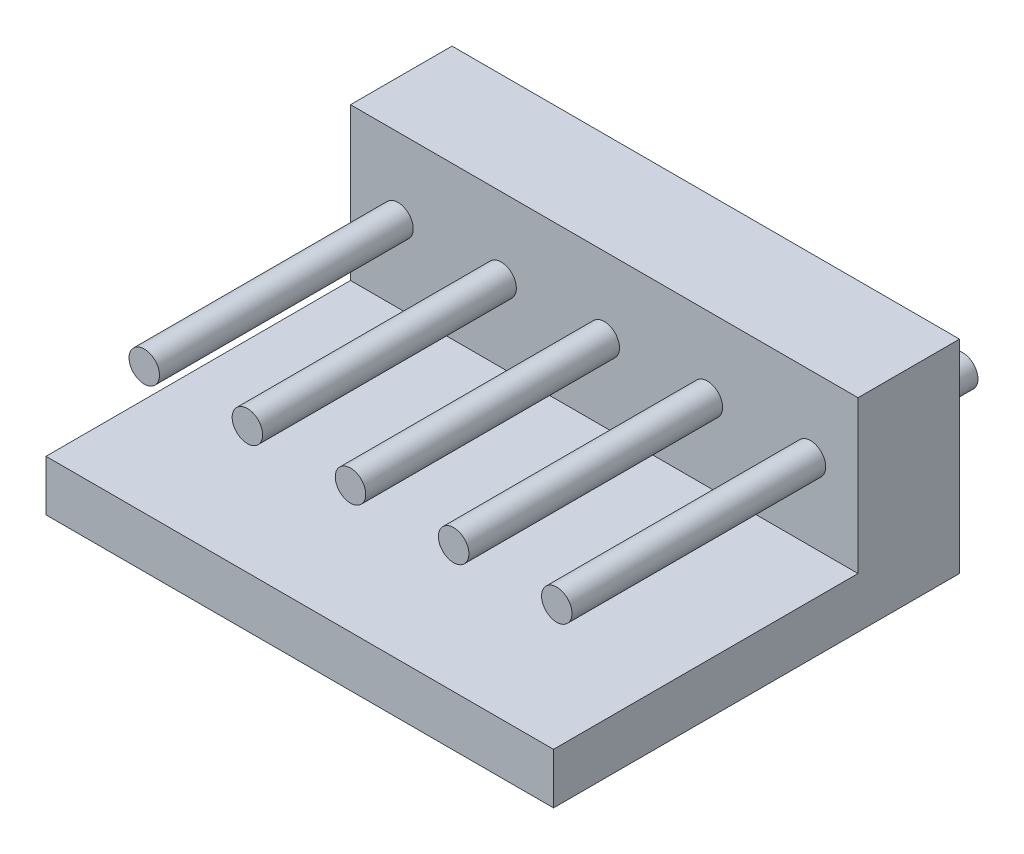
ISO-10303-21;
HEADER;
FILE_DESCRIPTION(('STEP AP214'),'2;1');
FILE_NAME('part.step','',(''),(''),'','','');
FILE_SCHEMA(('AUTOMOTIVE_DESIGN { 1 0 10303 214 1 1 1 1 }'));
ENDSEC;
DATA;
#1=APPLICATION_CONTEXT('core data for automotive mechanical design processes');
#2=APPLICATION_PROTOCOL_DEFINITION('international standard','automotive_design',2000,#1);
#3=PRODUCT_CONTEXT('',#1,'mechanical');
#4=PRODUCT('Part','Part','',(#3));
#5=PRODUCT_RELATED_PRODUCT_CATEGORY('part','',(#4));
#6=PRODUCT_DEFINITION_FORMATION('','',#4);
#7=PRODUCT_DEFINITION_CONTEXT('part definition',#1,'design');
#8=PRODUCT_DEFINITION('design','',#6,#7);
#9=PRODUCT_DEFINITION_SHAPE('','',#8);
#10=(LENGTH_UNIT() NAMED_UNIT(*) SI_UNIT(.MILLI.,.METRE.));
#11=(NAMED_UNIT(*) PLANE_ANGLE_UNIT() SI_UNIT($,.RADIAN.));
#12=(NAMED_UNIT(*) SI_UNIT($,.STERADIAN.) SOLID_ANGLE_UNIT());
#13=UNCERTAINTY_MEASURE_WITH_UNIT(LENGTH_MEASURE(1.E-05),#10,'distance_accuracy_value','');
#14=(GEOMETRIC_REPRESENTATION_CONTEXT(3) GLOBAL_UNCERTAINTY_ASSIGNED_CONTEXT((#13)) GLOBAL_UNIT_ASSIGNED_CONTEXT((#10,
#11,#12)) REPRESENTATION_CONTEXT('',''));
#15=CARTESIAN_POINT('',(0.,0.,0.));
#16=DIRECTION('',(0.,0.,1.));
#17=DIRECTION('',(1.,0.,0.));
#18=AXIS2_PLACEMENT_3D('',#15,#16,#17);
#19=CARTESIAN_POINT('',(0.,10.,5.));
#20=DIRECTION('',(0.,0.,-1.));
#21=DIRECTION('',(-1.,0.,0.));
#22=AXIS2_PLACEMENT_3D('',#19,#20,#21);
#23=PLANE('',#22);
#24=CARTESIAN_POINT('',(2.34,6.25,5.));
#25=DIRECTION('',(0.,0.,-1.));
#26=DIRECTION('',(-1.,0.,0.));
#27=AXIS2_PLACEMENT_3D('',#24,#25,#26);
#28=CIRCLE('',#27,0.750000000000001);
#29=CARTESIAN_POINT('',(1.59,6.25,5.));
#30=VERTEX_POINT('',#29);
#31=EDGE_CURVE('E38',#30,#30,#28,.F.);
#32=ORIENTED_EDGE('',*,*,#31,.F.);
#33=EDGE_LOOP('',(#32));
#34=FACE_BOUND('',#33,.T.);
#35=CARTESIAN_POINT('',(7.42,6.25,5.));
#36=DIRECTION('',(0.,0.,-1.));
#37=DIRECTION('',(-1.,0.,0.));
#38=AXIS2_PLACEMENT_3D('',#35,#36,#37);
#39=CIRCLE('',#38,0.75);
#40=CARTESIAN_POINT('',(6.67,6.25,5.));
#41=VERTEX_POINT('',#40);
#42=EDGE_CURVE('E151',#41,#41,#39,.F.);
#43=ORIENTED_EDGE('',*,*,#42,.F.);
#44=EDGE_LOOP('',(#43));
#45=FACE_BOUND('',#44,.T.);
#46=DIRECTION('',(-1.,0.,0.));
#47=VECTOR('',#46,1.);
#48=CARTESIAN_POINT('',(0.,2.5,5.));
#49=LINE('',#48,#47);
#50=CARTESIAN_POINT('',(25.,2.5,5.));
#51=VERTEX_POINT('',#50);
#52=CARTESIAN_POINT('',(0.,2.5,5.));
#53=VERTEX_POINT('',#52);
#54=EDGE_CURVE('E46',#51,#53,#49,.T.);
#55=ORIENTED_EDGE('',*,*,#54,.F.);
#56=DIRECTION('',(0.,1.,0.));
#57=VECTOR('',#56,1.);
#58=CARTESIAN_POINT('',(25.,0.,5.));
#59=LINE('',#58,#57);
#60=CARTESIAN_POINT('',(25.,10.,5.));
#61=VERTEX_POINT('',#60);
#62=EDGE_CURVE('E86',#51,#61,#59,.T.);
#63=ORIENTED_EDGE('',*,*,#62,.T.);
#64=DIRECTION('',(-1.,0.,0.));
#65=VECTOR('',#64,1.);
#66=CARTESIAN_POINT('',(0.,10.,5.));
#67=LINE('',#66,#65);
#68=CARTESIAN_POINT('',(0.,10.,5.));
#69=VERTEX_POINT('',#68);
#70=EDGE_CURVE('E51',#61,#69,#67,.T.);
#71=ORIENTED_EDGE('',*,*,#70,.T.);
#72=DIRECTION('',(0.,-1.,0.));
#73=VECTOR('',#72,1.);
#74=CARTESIAN_POINT('',(0.,0.,5.));
#75=LINE('',#74,#73);
#76=EDGE_CURVE('E81',#69,#53,#75,.T.);
#77=ORIENTED_EDGE('',*,*,#76,.T.);
#78=EDGE_LOOP('',(#55,#63,#71,#77));
#79=FACE_BOUND('',#78,.T.);
#80=CARTESIAN_POINT('',(17.58,6.25,5.));
#81=DIRECTION('',(0.,0.,-1.));
#82=DIRECTION('',(-1.,0.,0.));
#83=AXIS2_PLACEMENT_3D('',#80,#81,#82);
#84=CIRCLE('',#83,0.750000000000002);
#85=CARTESIAN_POINT('',(16.83,6.25,5.));
#86=VERTEX_POINT('',#85);
#87=EDGE_CURVE('E158',#86,#86,#84,.F.);
#88=ORIENTED_EDGE('',*,*,#87,.F.);
#89=EDGE_LOOP('',(#88));
#90=FACE_BOUND('',#89,.T.);
#91=CARTESIAN_POINT('',(22.66,6.25,5.));
#92=DIRECTION('',(0.,0.,-1.));
#93=DIRECTION('',(-1.,0.,0.));
#94=AXIS2_PLACEMENT_3D('',#91,#92,#93);
#95=CIRCLE('',#94,0.750000000000002);
#96=CARTESIAN_POINT('',(21.91,6.25,5.));
#97=VERTEX_POINT('',#96);
#98=EDGE_CURVE('E145',#97,#97,#95,.F.);
#99=ORIENTED_EDGE('',*,*,#98,.F.);
#100=EDGE_LOOP('',(#99));
#101=FACE_BOUND('',#100,.T.);
#102=CARTESIAN_POINT('',(12.5,6.25,5.));
#103=DIRECTION('',(0.,0.,-1.));
#104=DIRECTION('',(-1.,0.,0.));
#105=AXIS2_PLACEMENT_3D('',#102,#103,#104);
#106=CIRCLE('',#105,0.75);
#107=CARTESIAN_POINT('',(11.75,6.25,5.));
#108=VERTEX_POINT('',#107);
#109=EDGE_CURVE('E11',#108,#108,#106,.F.);
#110=ORIENTED_EDGE('',*,*,#109,.F.);
#111=EDGE_LOOP('',(#110));
#112=FACE_BOUND('',#111,.T.);
#113=ADVANCED_FACE('F29',(#34,#45,#79,#90,#101,#112),#23,.F.);
#114=CARTESIAN_POINT('',(0.,10.,0.));
#115=DIRECTION('',(0.,0.,-1.));
#116=DIRECTION('',(-1.,0.,0.));
#117=AXIS2_PLACEMENT_3D('',#114,#115,#116);
#118=PLANE('',#117);
#119=CARTESIAN_POINT('',(2.34,6.25,0.));
#120=DIRECTION('',(0.,0.,-1.));
#121=DIRECTION('',(-1.,0.,0.));
#122=AXIS2_PLACEMENT_3D('',#119,#120,#121);
#123=CIRCLE('',#122,0.750000000000001);
#124=CARTESIAN_POINT('',(1.59,6.25,0.));
#125=VERTEX_POINT('',#124);
#126=EDGE_CURVE('E128',#125,#125,#123,.F.);
#127=ORIENTED_EDGE('',*,*,#126,.T.);
#128=EDGE_LOOP('',(#127));
#129=FACE_BOUND('',#128,.T.);
#130=CARTESIAN_POINT('',(7.42,6.25,0.));
#131=DIRECTION('',(0.,0.,-1.));
#132=DIRECTION('',(-1.,0.,0.));
#133=AXIS2_PLACEMENT_3D('',#130,#131,#132);
#134=CIRCLE('',#133,0.75);
#135=CARTESIAN_POINT('',(6.67,6.25,0.));
#136=VERTEX_POINT('',#135);
#137=EDGE_CURVE('E119',#136,#136,#134,.F.);
#138=ORIENTED_EDGE('',*,*,#137,.T.);
#139=EDGE_LOOP('',(#138));
#140=FACE_BOUND('',#139,.T.);
#141=DIRECTION('',(0.,-1.,0.));
#142=VECTOR('',#141,1.);
#143=CARTESIAN_POINT('',(0.,0.,0.));
#144=LINE('',#143,#142);
#145=CARTESIAN_POINT('',(0.,10.,0.));
#146=VERTEX_POINT('',#145);
#147=CARTESIAN_POINT('',(0.,0.,0.));
#148=VERTEX_POINT('',#147);
#149=EDGE_CURVE('E105',#146,#148,#144,.T.);
#150=ORIENTED_EDGE('',*,*,#149,.F.);
#151=DIRECTION('',(-1.,0.,0.));
#152=VECTOR('',#151,1.);
#153=CARTESIAN_POINT('',(0.,10.,0.));
#154=LINE('',#153,#152);
#155=CARTESIAN_POINT('',(25.,10.,0.));
#156=VERTEX_POINT('',#155);
#157=EDGE_CURVE('E87',#156,#146,#154,.T.);
#158=ORIENTED_EDGE('',*,*,#157,.F.);
#159=DIRECTION('',(0.,1.,0.));
#160=VECTOR('',#159,1.);
#161=CARTESIAN_POINT('',(25.,0.,0.));
#162=LINE('',#161,#160);
#163=CARTESIAN_POINT('',(25.,0.,0.));
#164=VERTEX_POINT('',#163);
#165=EDGE_CURVE('E175',#164,#156,#162,.T.);
#166=ORIENTED_EDGE('',*,*,#165,.F.);
#167=DIRECTION('',(1.,0.,0.));
#168=VECTOR('',#167,1.);
#169=CARTESIAN_POINT('',(0.,0.,0.));
#170=LINE('',#169,#168);
#171=EDGE_CURVE('E173',#148,#164,#170,.T.);
#172=ORIENTED_EDGE('',*,*,#171,.F.);
#173=EDGE_LOOP('',(#150,#158,#166,#172));
#174=FACE_BOUND('',#173,.T.);
#175=CARTESIAN_POINT('',(17.58,6.25,0.));
#176=DIRECTION('',(0.,0.,-1.));
#177=DIRECTION('',(-1.,0.,0.));
#178=AXIS2_PLACEMENT_3D('',#175,#176,#177);
#179=CIRCLE('',#178,0.750000000000002);
#180=CARTESIAN_POINT('',(16.83,6.25,0.));
#181=VERTEX_POINT('',#180);
#182=EDGE_CURVE('E99',#181,#181,#179,.F.);
#183=ORIENTED_EDGE('',*,*,#182,.T.);
#184=EDGE_LOOP('',(#183));
#185=FACE_BOUND('',#184,.T.);
#186=CARTESIAN_POINT('',(22.66,6.25,0.));
#187=DIRECTION('',(0.,0.,-1.));
#188=DIRECTION('',(-1.,0.,0.));
#189=AXIS2_PLACEMENT_3D('',#186,#187,#188);
#190=CIRCLE('',#189,0.750000000000002);
#191=CARTESIAN_POINT('',(21.91,6.25,0.));
#192=VERTEX_POINT('',#191);
#193=EDGE_CURVE('E124',#192,#192,#190,.F.);
#194=ORIENTED_EDGE('',*,*,#193,.T.);
#195=EDGE_LOOP('',(#194));
#196=FACE_BOUND('',#195,.T.);
#197=CARTESIAN_POINT('',(12.5,6.25,0.));
#198=DIRECTION('',(0.,0.,-1.));
#199=DIRECTION('',(-1.,0.,0.));
#200=AXIS2_PLACEMENT_3D('',#197,#198,#199);
#201=CIRCLE('',#200,0.75);
#202=CARTESIAN_POINT('',(11.75,6.25,0.));
#203=VERTEX_POINT('',#202);
#204=EDGE_CURVE('E33',#203,#203,#201,.F.);
#205=ORIENTED_EDGE('',*,*,#204,.T.);
#206=EDGE_LOOP('',(#205));
#207=FACE_BOUND('',#206,.T.);
#208=ADVANCED_FACE('F202',(#129,#140,#174,#185,#196,#207),#118,.T.);
#209=CARTESIAN_POINT('',(0.,0.,5.));
#210=DIRECTION('',(1.,0.,0.));
#211=DIRECTION('',(0.,0.,-1.));
#212=AXIS2_PLACEMENT_3D('',#209,#210,#211);
#213=PLANE('',#212);
#214=ORIENTED_EDGE('',*,*,#149,.T.);
#215=DIRECTION('',(0.,0.,-1.));
#216=VECTOR('',#215,1.);
#217=CARTESIAN_POINT('',(0.,0.,5.));
#218=LINE('',#217,#216);
#219=CARTESIAN_POINT('',(0.,0.,20.));
#220=VERTEX_POINT('',#219);
#221=EDGE_CURVE('E164',#220,#148,#218,.T.);
#222=ORIENTED_EDGE('',*,*,#221,.F.);
#223=DIRECTION('',(0.,-1.,0.));
#224=VECTOR('',#223,1.);
#225=CARTESIAN_POINT('',(0.,0.,20.));
#226=LINE('',#225,#224);
#227=CARTESIAN_POINT('',(0.,2.5,20.));
#228=VERTEX_POINT('',#227);
#229=EDGE_CURVE('E98',#228,#220,#226,.T.);
#230=ORIENTED_EDGE('',*,*,#229,.F.);
#231=DIRECTION('',(0.,0.,-1.));
#232=VECTOR('',#231,1.);
#233=CARTESIAN_POINT('',(0.,2.5,20.));
#234=LINE('',#233,#232);
#235=EDGE_CURVE('E94',#228,#53,#234,.T.);
#236=ORIENTED_EDGE('',*,*,#235,.T.);
#237=ORIENTED_EDGE('',*,*,#76,.F.);
#238=DIRECTION('',(0.,0.,-1.));
#239=VECTOR('',#238,1.);
#240=CARTESIAN_POINT('',(0.,10.,5.));
#241=LINE('',#240,#239);
#242=EDGE_CURVE('E185',#69,#146,#241,.T.);
#243=ORIENTED_EDGE('',*,*,#242,.T.);
#244=EDGE_LOOP('',(#214,#222,#230,#236,#237,#243));
#245=FACE_BOUND('',#244,.T.);
#246=ADVANCED_FACE('F31',(#245),#213,.F.);
#247=CARTESIAN_POINT('',(0.,0.,5.));
#248=DIRECTION('',(0.,1.,0.));
#249=DIRECTION('',(0.,0.,1.));
#250=AXIS2_PLACEMENT_3D('',#247,#248,#249);
#251=PLANE('',#250);
#252=ORIENTED_EDGE('',*,*,#171,.T.);
#253=DIRECTION('',(0.,0.,-1.));
#254=VECTOR('',#253,1.);
#255=CARTESIAN_POINT('',(25.,0.,5.));
#256=LINE('',#255,#254);
#257=CARTESIAN_POINT('',(25.,0.,20.));
#258=VERTEX_POINT('',#257);
#259=EDGE_CURVE('E190',#258,#164,#256,.T.);
#260=ORIENTED_EDGE('',*,*,#259,.F.);
#261=DIRECTION('',(1.,0.,0.));
#262=VECTOR('',#261,1.);
#263=CARTESIAN_POINT('',(0.,0.,20.));
#264=LINE('',#263,#262);
#265=EDGE_CURVE('E168',#220,#258,#264,.T.);
#266=ORIENTED_EDGE('',*,*,#265,.F.);
#267=ORIENTED_EDGE('',*,*,#221,.T.);
#268=EDGE_LOOP('',(#252,#260,#266,#267));
#269=FACE_BOUND('',#268,.T.);
#270=ADVANCED_FACE('F198',(#269),#251,.F.);
#271=CARTESIAN_POINT('',(25.,0.,5.));
#272=DIRECTION('',(-1.,0.,0.));
#273=DIRECTION('',(0.,0.,1.));
#274=AXIS2_PLACEMENT_3D('',#271,#272,#273);
#275=PLANE('',#274);
#276=ORIENTED_EDGE('',*,*,#165,.T.);
#277=DIRECTION('',(0.,0.,-1.));
#278=VECTOR('',#277,1.);
#279=CARTESIAN_POINT('',(25.,10.,5.));
#280=LINE('',#279,#278);
#281=EDGE_CURVE('E186',#61,#156,#280,.T.);
#282=ORIENTED_EDGE('',*,*,#281,.F.);
#283=ORIENTED_EDGE('',*,*,#62,.F.);
#284=DIRECTION('',(0.,0.,-1.));
#285=VECTOR('',#284,1.);
#286=CARTESIAN_POINT('',(25.,2.5,20.));
#287=LINE('',#286,#285);
#288=CARTESIAN_POINT('',(25.,2.5,20.));
#289=VERTEX_POINT('',#288);
#290=EDGE_CURVE('E97',#289,#51,#287,.T.);
#291=ORIENTED_EDGE('',*,*,#290,.F.);
#292=DIRECTION('',(0.,1.,0.));
#293=VECTOR('',#292,1.);
#294=CARTESIAN_POINT('',(25.,0.,20.));
#295=LINE('',#294,#293);
#296=EDGE_CURVE('E107',#258,#289,#295,.T.);
#297=ORIENTED_EDGE('',*,*,#296,.F.);
#298=ORIENTED_EDGE('',*,*,#259,.T.);
#299=EDGE_LOOP('',(#276,#282,#283,#291,#297,#298));
#300=FACE_BOUND('',#299,.T.);
#301=ADVANCED_FACE('F204',(#300),#275,.F.);
#302=CARTESIAN_POINT('',(0.,10.,5.));
#303=DIRECTION('',(0.,-1.,0.));
#304=DIRECTION('',(0.,0.,-1.));
#305=AXIS2_PLACEMENT_3D('',#302,#303,#304);
#306=PLANE('',#305);
#307=ORIENTED_EDGE('',*,*,#157,.T.);
#308=ORIENTED_EDGE('',*,*,#242,.F.);
#309=ORIENTED_EDGE('',*,*,#70,.F.);
#310=ORIENTED_EDGE('',*,*,#281,.T.);
#311=EDGE_LOOP('',(#307,#308,#309,#310));
#312=FACE_BOUND('',#311,.T.);
#313=ADVANCED_FACE('F206',(#312),#306,.F.);
#314=CARTESIAN_POINT('',(0.,2.5,20.));
#315=DIRECTION('',(0.,-1.,0.));
#316=DIRECTION('',(0.,0.,-1.));
#317=AXIS2_PLACEMENT_3D('',#314,#315,#316);
#318=PLANE('',#317);
#319=ORIENTED_EDGE('',*,*,#54,.T.);
#320=ORIENTED_EDGE('',*,*,#235,.F.);
#321=DIRECTION('',(-1.,0.,0.));
#322=VECTOR('',#321,1.);
#323=CARTESIAN_POINT('',(0.,2.5,20.));
#324=LINE('',#323,#322);
#325=EDGE_CURVE('E103',#289,#228,#324,.T.);
#326=ORIENTED_EDGE('',*,*,#325,.F.);
#327=ORIENTED_EDGE('',*,*,#290,.T.);
#328=EDGE_LOOP('',(#319,#320,#326,#327));
#329=FACE_BOUND('',#328,.T.);
#330=ADVANCED_FACE('F92',(#329),#318,.F.);
#331=CARTESIAN_POINT('',(0.,2.5,20.));
#332=DIRECTION('',(0.,0.,-1.));
#333=DIRECTION('',(-1.,0.,0.));
#334=AXIS2_PLACEMENT_3D('',#331,#332,#333);
#335=PLANE('',#334);
#336=ORIENTED_EDGE('',*,*,#229,.T.);
#337=ORIENTED_EDGE('',*,*,#265,.T.);
#338=ORIENTED_EDGE('',*,*,#296,.T.);
#339=ORIENTED_EDGE('',*,*,#325,.T.);
#340=EDGE_LOOP('',(#336,#337,#338,#339));
#341=FACE_BOUND('',#340,.T.);
#342=ADVANCED_FACE('F213',(#341),#335,.F.);
#343=CARTESIAN_POINT('',(17.58,6.25,-2.5));
#344=DIRECTION('',(0.,0.,1.));
#345=DIRECTION('',(1.,0.,0.));
#346=AXIS2_PLACEMENT_3D('',#343,#344,#345);
#347=PLANE('',#346);
#348=CARTESIAN_POINT('',(17.58,6.25,-2.5));
#349=DIRECTION('',(0.,0.,1.));
#350=DIRECTION('',(1.,0.,0.));
#351=AXIS2_PLACEMENT_3D('',#348,#349,#350);
#352=CIRCLE('',#351,0.750000000000002);
#353=CARTESIAN_POINT('',(18.33,6.25,-2.5));
#354=VERTEX_POINT('',#353);
#355=EDGE_CURVE('E122',#354,#354,#352,.T.);
#356=ORIENTED_EDGE('',*,*,#355,.F.);
#357=EDGE_LOOP('',(#356));
#358=FACE_BOUND('',#357,.T.);
#359=ADVANCED_FACE('F228',(#358),#347,.F.);
#360=CARTESIAN_POINT('',(17.58,6.25,17.5));
#361=DIRECTION('',(0.,0.,-1.));
#362=DIRECTION('',(-1.,0.,0.));
#363=AXIS2_PLACEMENT_3D('',#360,#361,#362);
#364=CYLINDRICAL_SURFACE('',#363,0.750000000000002);
#365=ORIENTED_EDGE('',*,*,#182,.F.);
#366=EDGE_LOOP('',(#365));
#367=FACE_BOUND('',#366,.T.);
#368=ORIENTED_EDGE('',*,*,#355,.T.);
#369=EDGE_LOOP('',(#368));
#370=FACE_BOUND('',#369,.T.);
#371=ADVANCED_FACE('F230',(#367,#370),#364,.T.);
#372=CARTESIAN_POINT('',(17.58,6.25,17.5));
#373=DIRECTION('',(0.,0.,1.));
#374=DIRECTION('',(1.,0.,0.));
#375=AXIS2_PLACEMENT_3D('',#372,#373,#374);
#376=CIRCLE('',#375,0.750000000000002);
#377=CARTESIAN_POINT('',(18.33,6.25,17.5));
#378=VERTEX_POINT('',#377);
#379=EDGE_CURVE('E118',#378,#378,#376,.T.);
#380=ORIENTED_EDGE('',*,*,#379,.F.);
#381=EDGE_LOOP('',(#380));
#382=FACE_BOUND('',#381,.T.);
#383=ORIENTED_EDGE('',*,*,#87,.T.);
#384=EDGE_LOOP('',(#383));
#385=FACE_BOUND('',#384,.T.);
#386=ADVANCED_FACE('F233',(#382,#385),#364,.T.);
#387=CARTESIAN_POINT('',(17.58,6.25,17.5));
#388=DIRECTION('',(0.,0.,1.));
#389=DIRECTION('',(1.,0.,0.));
#390=AXIS2_PLACEMENT_3D('',#387,#388,#389);
#391=PLANE('',#390);
#392=ORIENTED_EDGE('',*,*,#379,.T.);
#393=EDGE_LOOP('',(#392));
#394=FACE_BOUND('',#393,.T.);
#395=ADVANCED_FACE('F235',(#394),#391,.T.);
#396=CARTESIAN_POINT('',(7.42,6.25,-2.5));
#397=DIRECTION('',(0.,0.,1.));
#398=DIRECTION('',(1.,0.,0.));
#399=AXIS2_PLACEMENT_3D('',#396,#397,#398);
#400=PLANE('',#399);
#401=CARTESIAN_POINT('',(7.42,6.25,-2.5));
#402=DIRECTION('',(0.,0.,1.));
#403=DIRECTION('',(1.,0.,0.));
#404=AXIS2_PLACEMENT_3D('',#401,#402,#403);
#405=CIRCLE('',#404,0.75);
#406=CARTESIAN_POINT('',(8.17,6.25,-2.5));
#407=VERTEX_POINT('',#406);
#408=EDGE_CURVE('E126',#407,#407,#405,.T.);
#409=ORIENTED_EDGE('',*,*,#408,.F.);
#410=EDGE_LOOP('',(#409));
#411=FACE_BOUND('',#410,.T.);
#412=ADVANCED_FACE('F238',(#411),#400,.F.);
#413=CARTESIAN_POINT('',(7.42,6.25,17.5));
#414=DIRECTION('',(0.,0.,-1.));
#415=DIRECTION('',(-1.,0.,0.));
#416=AXIS2_PLACEMENT_3D('',#413,#414,#415);
#417=CYLINDRICAL_SURFACE('',#416,0.75);
#418=ORIENTED_EDGE('',*,*,#137,.F.);
#419=EDGE_LOOP('',(#418));
#420=FACE_BOUND('',#419,.T.);
#421=ORIENTED_EDGE('',*,*,#408,.T.);
#422=EDGE_LOOP('',(#421));
#423=FACE_BOUND('',#422,.T.);
#424=ADVANCED_FACE('F243',(#420,#423),#417,.T.);
#425=CARTESIAN_POINT('',(7.42,6.25,17.5));
#426=DIRECTION('',(0.,0.,1.));
#427=DIRECTION('',(1.,0.,0.));
#428=AXIS2_PLACEMENT_3D('',#425,#426,#427);
#429=CIRCLE('',#428,0.75);
#430=CARTESIAN_POINT('',(8.17,6.25,17.5));
#431=VERTEX_POINT('',#430);
#432=EDGE_CURVE('E123',#431,#431,#429,.T.);
#433=ORIENTED_EDGE('',*,*,#432,.F.);
#434=EDGE_LOOP('',(#433));
#435=FACE_BOUND('',#434,.T.);
#436=ORIENTED_EDGE('',*,*,#42,.T.);
#437=EDGE_LOOP('',(#436));
#438=FACE_BOUND('',#437,.T.);
#439=ADVANCED_FACE('F246',(#435,#438),#417,.T.);
#440=CARTESIAN_POINT('',(7.42,6.25,17.5));
#441=DIRECTION('',(0.,0.,1.));
#442=DIRECTION('',(1.,0.,0.));
#443=AXIS2_PLACEMENT_3D('',#440,#441,#442);
#444=PLANE('',#443);
#445=ORIENTED_EDGE('',*,*,#432,.T.);
#446=EDGE_LOOP('',(#445));
#447=FACE_BOUND('',#446,.T.);
#448=ADVANCED_FACE('F248',(#447),#444,.T.);
#449=CARTESIAN_POINT('',(22.66,6.25,-2.5));
#450=DIRECTION('',(0.,0.,1.));
#451=DIRECTION('',(1.,0.,0.));
#452=AXIS2_PLACEMENT_3D('',#449,#450,#451);
#453=PLANE('',#452);
#454=CARTESIAN_POINT('',(22.66,6.25,-2.5));
#455=DIRECTION('',(0.,0.,1.));
#456=DIRECTION('',(1.,0.,0.));
#457=AXIS2_PLACEMENT_3D('',#454,#455,#456);
#458=CIRCLE('',#457,0.750000000000002);
#459=CARTESIAN_POINT('',(23.41,6.25,-2.5));
#460=VERTEX_POINT('',#459);
#461=EDGE_CURVE('E130',#460,#460,#458,.T.);
#462=ORIENTED_EDGE('',*,*,#461,.F.);
#463=EDGE_LOOP('',(#462));
#464=FACE_BOUND('',#463,.T.);
#465=ADVANCED_FACE('F251',(#464),#453,.F.);
#466=CARTESIAN_POINT('',(22.66,6.25,17.5));
#467=DIRECTION('',(0.,0.,-1.));
#468=DIRECTION('',(-1.,0.,0.));
#469=AXIS2_PLACEMENT_3D('',#466,#467,#468);
#470=CYLINDRICAL_SURFACE('',#469,0.750000000000002);
#471=ORIENTED_EDGE('',*,*,#193,.F.);
#472=EDGE_LOOP('',(#471));
#473=FACE_BOUND('',#472,.T.);
#474=ORIENTED_EDGE('',*,*,#461,.T.);
#475=EDGE_LOOP('',(#474));
#476=FACE_BOUND('',#475,.T.);
#477=ADVANCED_FACE('F256',(#473,#476),#470,.T.);
#478=CARTESIAN_POINT('',(22.66,6.25,17.5));
#479=DIRECTION('',(0.,0.,1.));
#480=DIRECTION('',(1.,0.,0.));
#481=AXIS2_PLACEMENT_3D('',#478,#479,#480);
#482=CIRCLE('',#481,0.750000000000002);
#483=CARTESIAN_POINT('',(23.41,6.25,17.5));
#484=VERTEX_POINT('',#483);
#485=EDGE_CURVE('E127',#484,#484,#482,.T.);
#486=ORIENTED_EDGE('',*,*,#485,.F.);
#487=EDGE_LOOP('',(#486));
#488=FACE_BOUND('',#487,.T.);
#489=ORIENTED_EDGE('',*,*,#98,.T.);
#490=EDGE_LOOP('',(#489));
#491=FACE_BOUND('',#490,.T.);
#492=ADVANCED_FACE('F259',(#488,#491),#470,.T.);
#493=CARTESIAN_POINT('',(22.66,6.25,17.5));
#494=DIRECTION('',(0.,0.,1.));
#495=DIRECTION('',(1.,0.,0.));
#496=AXIS2_PLACEMENT_3D('',#493,#494,#495);
#497=PLANE('',#496);
#498=ORIENTED_EDGE('',*,*,#485,.T.);
#499=EDGE_LOOP('',(#498));
#500=FACE_BOUND('',#499,.T.);
#501=ADVANCED_FACE('F261',(#500),#497,.T.);
#502=CARTESIAN_POINT('',(2.34,6.25,-2.5));
#503=DIRECTION('',(0.,0.,1.));
#504=DIRECTION('',(1.,0.,0.));
#505=AXIS2_PLACEMENT_3D('',#502,#503,#504);
#506=PLANE('',#505);
#507=CARTESIAN_POINT('',(2.34,6.25,-2.5));
#508=DIRECTION('',(0.,0.,1.));
#509=DIRECTION('',(1.,0.,0.));
#510=AXIS2_PLACEMENT_3D('',#507,#508,#509);
#511=CIRCLE('',#510,0.750000000000001);
#512=CARTESIAN_POINT('',(3.09,6.25,-2.5));
#513=VERTEX_POINT('',#512);
#514=EDGE_CURVE('E137',#513,#513,#511,.T.);
#515=ORIENTED_EDGE('',*,*,#514,.F.);
#516=EDGE_LOOP('',(#515));
#517=FACE_BOUND('',#516,.T.);
#518=ADVANCED_FACE('F264',(#517),#506,.F.);
#519=CARTESIAN_POINT('',(2.34,6.25,17.5));
#520=DIRECTION('',(0.,0.,-1.));
#521=DIRECTION('',(-1.,0.,0.));
#522=AXIS2_PLACEMENT_3D('',#519,#520,#521);
#523=CYLINDRICAL_SURFACE('',#522,0.750000000000001);
#524=ORIENTED_EDGE('',*,*,#126,.F.);
#525=EDGE_LOOP('',(#524));
#526=FACE_BOUND('',#525,.T.);
#527=ORIENTED_EDGE('',*,*,#514,.T.);
#528=EDGE_LOOP('',(#527));
#529=FACE_BOUND('',#528,.T.);
#530=ADVANCED_FACE('F269',(#526,#529),#523,.T.);
#531=CARTESIAN_POINT('',(2.34,6.25,17.5));
#532=DIRECTION('',(0.,0.,1.));
#533=DIRECTION('',(1.,0.,0.));
#534=AXIS2_PLACEMENT_3D('',#531,#532,#533);
#535=CIRCLE('',#534,0.750000000000001);
#536=CARTESIAN_POINT('',(3.09,6.25,17.5));
#537=VERTEX_POINT('',#536);
#538=EDGE_CURVE('E131',#537,#537,#535,.T.);
#539=ORIENTED_EDGE('',*,*,#538,.F.);
#540=EDGE_LOOP('',(#539));
#541=FACE_BOUND('',#540,.T.);
#542=ORIENTED_EDGE('',*,*,#31,.T.);
#543=EDGE_LOOP('',(#542));
#544=FACE_BOUND('',#543,.T.);
#545=ADVANCED_FACE('F272',(#541,#544),#523,.T.);
#546=CARTESIAN_POINT('',(2.34,6.25,17.5));
#547=DIRECTION('',(0.,0.,1.));
#548=DIRECTION('',(1.,0.,0.));
#549=AXIS2_PLACEMENT_3D('',#546,#547,#548);
#550=PLANE('',#549);
#551=ORIENTED_EDGE('',*,*,#538,.T.);
#552=EDGE_LOOP('',(#551));
#553=FACE_BOUND('',#552,.T.);
#554=ADVANCED_FACE('F274',(#553),#550,.T.);
#555=CARTESIAN_POINT('',(12.5,6.25,-2.5));
#556=DIRECTION('',(0.,0.,1.));
#557=DIRECTION('',(1.,0.,0.));
#558=AXIS2_PLACEMENT_3D('',#555,#556,#557);
#559=PLANE('',#558);
#560=CARTESIAN_POINT('',(12.5,6.25,-2.5));
#561=DIRECTION('',(0.,0.,1.));
#562=DIRECTION('',(1.,0.,0.));
#563=AXIS2_PLACEMENT_3D('',#560,#561,#562);
#564=CIRCLE('',#563,0.75);
#565=CARTESIAN_POINT('',(13.25,6.25,-2.5));
#566=VERTEX_POINT('',#565);
#567=EDGE_CURVE('E296',#566,#566,#564,.T.);
#568=ORIENTED_EDGE('',*,*,#567,.F.);
#569=EDGE_LOOP('',(#568));
#570=FACE_BOUND('',#569,.T.);
#571=ADVANCED_FACE('F277',(#570),#559,.F.);
#572=CARTESIAN_POINT('',(12.5,6.25,17.5));
#573=DIRECTION('',(0.,0.,-1.));
#574=DIRECTION('',(-1.,0.,0.));
#575=AXIS2_PLACEMENT_3D('',#572,#573,#574);
#576=CYLINDRICAL_SURFACE('',#575,0.75);
#577=ORIENTED_EDGE('',*,*,#204,.F.);
#578=EDGE_LOOP('',(#577));
#579=FACE_BOUND('',#578,.T.);
#580=ORIENTED_EDGE('',*,*,#567,.T.);
#581=EDGE_LOOP('',(#580));
#582=FACE_BOUND('',#581,.T.);
#583=ADVANCED_FACE('F281',(#579,#582),#576,.T.);
#584=CARTESIAN_POINT('',(12.5,6.25,17.5));
#585=DIRECTION('',(0.,0.,1.));
#586=DIRECTION('',(1.,0.,0.));
#587=AXIS2_PLACEMENT_3D('',#584,#585,#586);
#588=CIRCLE('',#587,0.75);
#589=CARTESIAN_POINT('',(13.25,6.25,17.5));
#590=VERTEX_POINT('',#589);
#591=EDGE_CURVE('E298',#590,#590,#588,.T.);
#592=ORIENTED_EDGE('',*,*,#591,.F.);
#593=EDGE_LOOP('',(#592));
#594=FACE_BOUND('',#593,.T.);
#595=ORIENTED_EDGE('',*,*,#109,.T.);
#596=EDGE_LOOP('',(#595));
#597=FACE_BOUND('',#596,.T.);
#598=ADVANCED_FACE('F284',(#594,#597),#576,.T.);
#599=CARTESIAN_POINT('',(12.5,6.25,17.5));
#600=DIRECTION('',(0.,0.,1.));
#601=DIRECTION('',(1.,0.,0.));
#602=AXIS2_PLACEMENT_3D('',#599,#600,#601);
#603=PLANE('',#602);
#604=ORIENTED_EDGE('',*,*,#591,.T.);
#605=EDGE_LOOP('',(#604));
#606=FACE_BOUND('',#605,.T.);
#607=ADVANCED_FACE('F286',(#606),#603,.T.);
#608=CLOSED_SHELL('',(#113,#208,#246,#270,#301,#313,#330,#342,#359,#371,#386,#395,#412,#424,
#439,#448,#465,#477,#492,#501,#518,#530,#545,#554,#571,#583,#598,#607));
#609=MANIFOLD_SOLID_BREP('B2',#608);
#610=ADVANCED_BREP_SHAPE_REPRESENTATION('',(#18,#609),#14);
#611=SHAPE_DEFINITION_REPRESENTATION(#9,#610);
ENDSEC;
END-ISO-10303-21;
